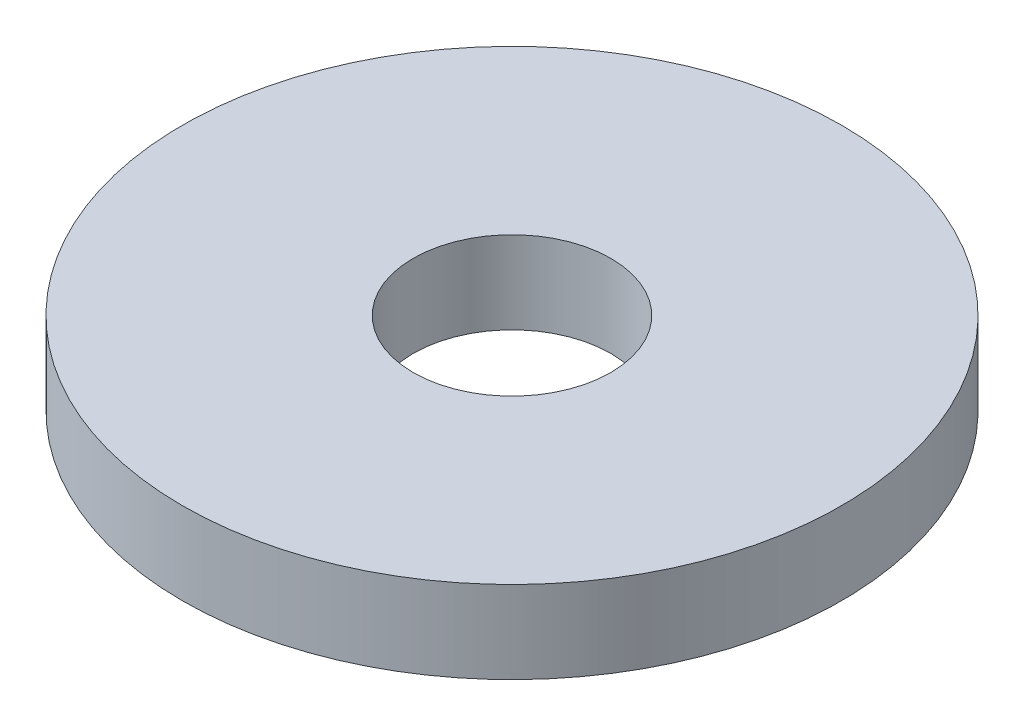
ISO-10303-21;
HEADER;
FILE_DESCRIPTION(('STEP AP214'),'2;1');
FILE_NAME('part.step','',(''),(''),'','','');
FILE_SCHEMA(('AUTOMOTIVE_DESIGN { 1 0 10303 214 1 1 1 1 }'));
ENDSEC;
DATA;
#1=APPLICATION_CONTEXT('core data for automotive mechanical design processes');
#2=APPLICATION_PROTOCOL_DEFINITION('international standard','automotive_design',2000,#1);
#3=PRODUCT_CONTEXT('',#1,'mechanical');
#4=PRODUCT('Part','Part','',(#3));
#5=PRODUCT_RELATED_PRODUCT_CATEGORY('part','',(#4));
#6=PRODUCT_DEFINITION_FORMATION('','',#4);
#7=PRODUCT_DEFINITION_CONTEXT('part definition',#1,'design');
#8=PRODUCT_DEFINITION('design','',#6,#7);
#9=PRODUCT_DEFINITION_SHAPE('','',#8);
#10=(LENGTH_UNIT() NAMED_UNIT(*) SI_UNIT(.MILLI.,.METRE.));
#11=(NAMED_UNIT(*) PLANE_ANGLE_UNIT() SI_UNIT($,.RADIAN.));
#12=(NAMED_UNIT(*) SI_UNIT($,.STERADIAN.) SOLID_ANGLE_UNIT());
#13=UNCERTAINTY_MEASURE_WITH_UNIT(LENGTH_MEASURE(1.E-05),#10,'distance_accuracy_value','');
#14=(GEOMETRIC_REPRESENTATION_CONTEXT(3) GLOBAL_UNCERTAINTY_ASSIGNED_CONTEXT((#13)) GLOBAL_UNIT_ASSIGNED_CONTEXT((#10,
#11,#12)) REPRESENTATION_CONTEXT('',''));
#15=CARTESIAN_POINT('',(0.,0.,0.));
#16=DIRECTION('',(0.,0.,1.));
#17=DIRECTION('',(1.,0.,0.));
#18=AXIS2_PLACEMENT_3D('',#15,#16,#17);
#19=CARTESIAN_POINT('',(0.,1.,0.));
#20=DIRECTION('',(0.,-1.,0.));
#21=DIRECTION('',(0.,0.,-1.));
#22=AXIS2_PLACEMENT_3D('',#19,#20,#21);
#23=CYLINDRICAL_SURFACE('',#22,4.);
#24=CARTESIAN_POINT('',(0.,1.,0.));
#25=DIRECTION('',(0.,1.,0.));
#26=DIRECTION('',(0.,0.,1.));
#27=AXIS2_PLACEMENT_3D('',#24,#25,#26);
#28=CIRCLE('',#27,4.);
#29=CARTESIAN_POINT('',(0.,1.,4.));
#30=VERTEX_POINT('',#29);
#31=EDGE_CURVE('E10',#30,#30,#28,.T.);
#32=ORIENTED_EDGE('',*,*,#31,.F.);
#33=EDGE_LOOP('',(#32));
#34=FACE_BOUND('',#33,.T.);
#35=CARTESIAN_POINT('',(0.,0.,0.));
#36=DIRECTION('',(0.,1.,0.));
#37=DIRECTION('',(0.,0.,1.));
#38=AXIS2_PLACEMENT_3D('',#35,#36,#37);
#39=CIRCLE('',#38,4.);
#40=CARTESIAN_POINT('',(0.,0.,4.));
#41=VERTEX_POINT('',#40);
#42=EDGE_CURVE('E46',#41,#41,#39,.T.);
#43=ORIENTED_EDGE('',*,*,#42,.T.);
#44=EDGE_LOOP('',(#43));
#45=FACE_BOUND('',#44,.T.);
#46=ADVANCED_FACE('F43',(#34,#45),#23,.T.);
#47=CARTESIAN_POINT('',(0.,1.,0.));
#48=DIRECTION('',(0.,1.,0.));
#49=DIRECTION('',(0.,0.,1.));
#50=AXIS2_PLACEMENT_3D('',#47,#48,#49);
#51=PLANE('',#50);
#52=CARTESIAN_POINT('',(0.,1.,0.));
#53=DIRECTION('',(0.,1.,0.));
#54=DIRECTION('',(0.,0.,1.));
#55=AXIS2_PLACEMENT_3D('',#52,#53,#54);
#56=CIRCLE('',#55,1.2);
#57=CARTESIAN_POINT('',(0.,1.,1.2));
#58=VERTEX_POINT('',#57);
#59=EDGE_CURVE('E60',#58,#58,#56,.T.);
#60=ORIENTED_EDGE('',*,*,#59,.F.);
#61=EDGE_LOOP('',(#60));
#62=FACE_BOUND('',#61,.T.);
#63=ORIENTED_EDGE('',*,*,#31,.T.);
#64=EDGE_LOOP('',(#63));
#65=FACE_BOUND('',#64,.T.);
#66=ADVANCED_FACE('F67',(#62,#65),#51,.T.);
#67=CARTESIAN_POINT('',(0.,0.,0.));
#68=DIRECTION('',(0.,1.,0.));
#69=DIRECTION('',(0.,0.,1.));
#70=AXIS2_PLACEMENT_3D('',#67,#68,#69);
#71=PLANE('',#70);
#72=CARTESIAN_POINT('',(0.,0.,0.));
#73=DIRECTION('',(0.,1.,0.));
#74=DIRECTION('',(0.,0.,1.));
#75=AXIS2_PLACEMENT_3D('',#72,#73,#74);
#76=CIRCLE('',#75,1.2);
#77=CARTESIAN_POINT('',(0.,0.,1.2));
#78=VERTEX_POINT('',#77);
#79=EDGE_CURVE('E55',#78,#78,#76,.T.);
#80=ORIENTED_EDGE('',*,*,#79,.T.);
#81=EDGE_LOOP('',(#80));
#82=FACE_BOUND('',#81,.T.);
#83=ORIENTED_EDGE('',*,*,#42,.F.);
#84=EDGE_LOOP('',(#83));
#85=FACE_BOUND('',#84,.T.);
#86=ADVANCED_FACE('F69',(#82,#85),#71,.F.);
#87=CARTESIAN_POINT('',(0.,1.,0.));
#88=DIRECTION('',(0.,1.,0.));
#89=DIRECTION('',(0.,0.,1.));
#90=AXIS2_PLACEMENT_3D('',#87,#88,#89);
#91=CYLINDRICAL_SURFACE('',#90,1.2);
#92=ORIENTED_EDGE('',*,*,#79,.F.);
#93=EDGE_LOOP('',(#92));
#94=FACE_BOUND('',#93,.T.);
#95=ORIENTED_EDGE('',*,*,#59,.T.);
#96=EDGE_LOOP('',(#95));
#97=FACE_BOUND('',#96,.T.);
#98=ADVANCED_FACE('F65',(#94,#97),#91,.F.);
#99=CLOSED_SHELL('',(#46,#66,#86,#98));
#100=MANIFOLD_SOLID_BREP('B2',#99);
#101=ADVANCED_BREP_SHAPE_REPRESENTATION('',(#18,#100),#14);
#102=SHAPE_DEFINITION_REPRESENTATION(#9,#101);
ENDSEC;
END-ISO-10303-21;
